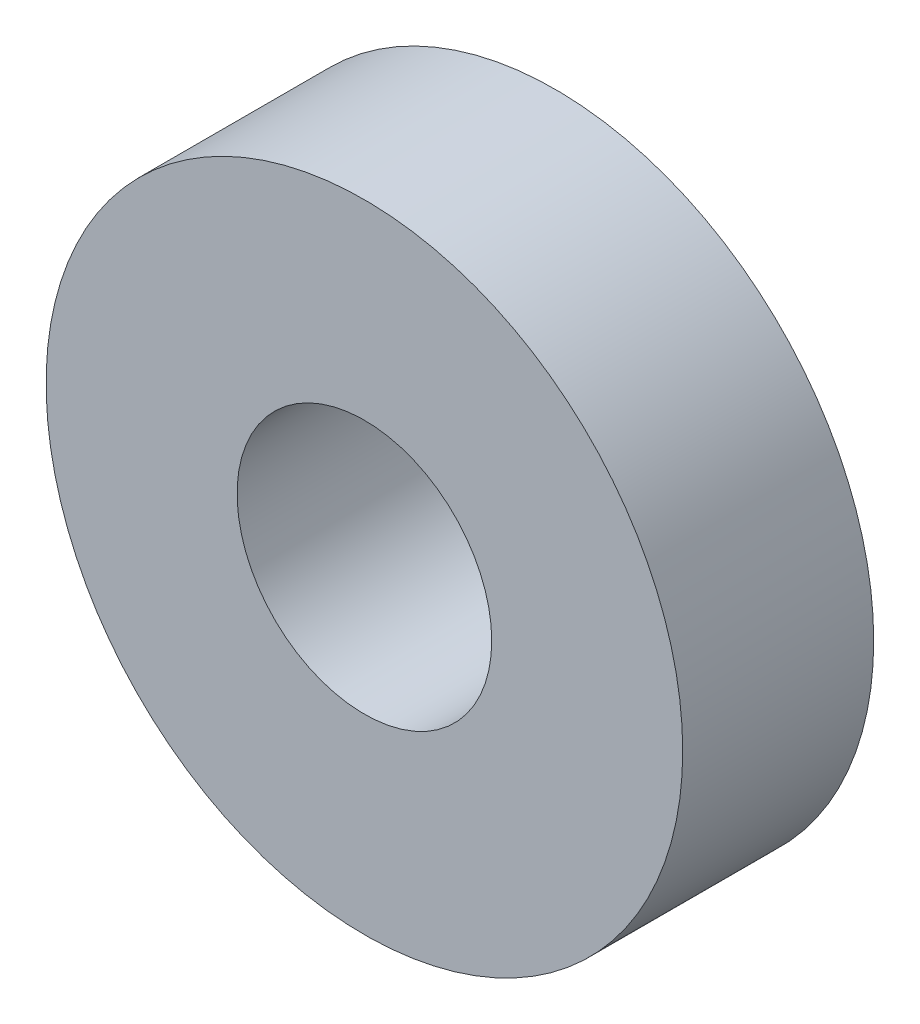
ISO-10303-21;
HEADER;
FILE_DESCRIPTION(('STEP AP214'),'2;1');
FILE_NAME('part.step','',(''),(''),'','','');
FILE_SCHEMA(('AUTOMOTIVE_DESIGN { 1 0 10303 214 1 1 1 1 }'));
ENDSEC;
DATA;
#1=APPLICATION_CONTEXT('core data for automotive mechanical design processes');
#2=APPLICATION_PROTOCOL_DEFINITION('international standard','automotive_design',2000,#1);
#3=PRODUCT_CONTEXT('',#1,'mechanical');
#4=PRODUCT('Part','Part','',(#3));
#5=PRODUCT_RELATED_PRODUCT_CATEGORY('part','',(#4));
#6=PRODUCT_DEFINITION_FORMATION('','',#4);
#7=PRODUCT_DEFINITION_CONTEXT('part definition',#1,'design');
#8=PRODUCT_DEFINITION('design','',#6,#7);
#9=PRODUCT_DEFINITION_SHAPE('','',#8);
#10=(LENGTH_UNIT() NAMED_UNIT(*) SI_UNIT(.MILLI.,.METRE.));
#11=(NAMED_UNIT(*) PLANE_ANGLE_UNIT() SI_UNIT($,.RADIAN.));
#12=(NAMED_UNIT(*) SI_UNIT($,.STERADIAN.) SOLID_ANGLE_UNIT());
#13=UNCERTAINTY_MEASURE_WITH_UNIT(LENGTH_MEASURE(1.E-05),#10,'distance_accuracy_value','');
#14=(GEOMETRIC_REPRESENTATION_CONTEXT(3) GLOBAL_UNCERTAINTY_ASSIGNED_CONTEXT((#13)) GLOBAL_UNIT_ASSIGNED_CONTEXT((#10,
#11,#12)) REPRESENTATION_CONTEXT('',''));
#15=CARTESIAN_POINT('',(0.,0.,0.));
#16=DIRECTION('',(0.,0.,1.));
#17=DIRECTION('',(1.,0.,0.));
#18=AXIS2_PLACEMENT_3D('',#15,#16,#17);
#19=CARTESIAN_POINT('',(0.,0.,1.5));
#20=DIRECTION('',(0.,0.,1.));
#21=DIRECTION('',(1.,0.,0.));
#22=AXIS2_PLACEMENT_3D('',#19,#20,#21);
#23=PLANE('',#22);
#24=CARTESIAN_POINT('',(0.,0.,1.5));
#25=DIRECTION('',(0.,0.,1.));
#26=DIRECTION('',(1.,0.,0.));
#27=AXIS2_PLACEMENT_3D('',#24,#25,#26);
#28=CIRCLE('',#27,2.5);
#29=CARTESIAN_POINT('',(2.5,0.,1.5));
#30=VERTEX_POINT('',#29);
#31=EDGE_CURVE('E10',#30,#30,#28,.T.);
#32=ORIENTED_EDGE('',*,*,#31,.T.);
#33=EDGE_LOOP('',(#32));
#34=FACE_BOUND('',#33,.T.);
#35=CARTESIAN_POINT('',(0.,0.,1.5));
#36=DIRECTION('',(0.,0.,1.));
#37=DIRECTION('',(1.,0.,0.));
#38=AXIS2_PLACEMENT_3D('',#35,#36,#37);
#39=CIRCLE('',#38,1.);
#40=CARTESIAN_POINT('',(1.,0.,1.5));
#41=VERTEX_POINT('',#40);
#42=EDGE_CURVE('E43',#41,#41,#39,.T.);
#43=ORIENTED_EDGE('',*,*,#42,.F.);
#44=EDGE_LOOP('',(#43));
#45=FACE_BOUND('',#44,.T.);
#46=ADVANCED_FACE('F32',(#34,#45),#23,.T.);
#47=CARTESIAN_POINT('',(0.,0.,0.));
#48=DIRECTION('',(0.,0.,1.));
#49=DIRECTION('',(1.,0.,0.));
#50=AXIS2_PLACEMENT_3D('',#47,#48,#49);
#51=PLANE('',#50);
#52=CARTESIAN_POINT('',(0.,0.,0.));
#53=DIRECTION('',(0.,0.,1.));
#54=DIRECTION('',(1.,0.,0.));
#55=AXIS2_PLACEMENT_3D('',#52,#53,#54);
#56=CIRCLE('',#55,2.5);
#57=CARTESIAN_POINT('',(2.5,0.,0.));
#58=VERTEX_POINT('',#57);
#59=EDGE_CURVE('E36',#58,#58,#56,.T.);
#60=ORIENTED_EDGE('',*,*,#59,.F.);
#61=EDGE_LOOP('',(#60));
#62=FACE_BOUND('',#61,.T.);
#63=CARTESIAN_POINT('',(0.,0.,0.));
#64=DIRECTION('',(0.,0.,1.));
#65=DIRECTION('',(1.,0.,0.));
#66=AXIS2_PLACEMENT_3D('',#63,#64,#65);
#67=CIRCLE('',#66,1.);
#68=CARTESIAN_POINT('',(1.,0.,0.));
#69=VERTEX_POINT('',#68);
#70=EDGE_CURVE('E45',#69,#69,#67,.T.);
#71=ORIENTED_EDGE('',*,*,#70,.T.);
#72=EDGE_LOOP('',(#71));
#73=FACE_BOUND('',#72,.T.);
#74=ADVANCED_FACE('F55',(#62,#73),#51,.F.);
#75=CARTESIAN_POINT('',(0.,0.,1.5));
#76=DIRECTION('',(0.,0.,-1.));
#77=DIRECTION('',(-1.,0.,0.));
#78=AXIS2_PLACEMENT_3D('',#75,#76,#77);
#79=CYLINDRICAL_SURFACE('',#78,2.5);
#80=ORIENTED_EDGE('',*,*,#31,.F.);
#81=EDGE_LOOP('',(#80));
#82=FACE_BOUND('',#81,.T.);
#83=ORIENTED_EDGE('',*,*,#59,.T.);
#84=EDGE_LOOP('',(#83));
#85=FACE_BOUND('',#84,.T.);
#86=ADVANCED_FACE('F34',(#82,#85),#79,.T.);
#87=CARTESIAN_POINT('',(0.,0.,1.5));
#88=DIRECTION('',(0.,0.,-1.));
#89=DIRECTION('',(-1.,0.,0.));
#90=AXIS2_PLACEMENT_3D('',#87,#88,#89);
#91=CYLINDRICAL_SURFACE('',#90,1.);
#92=ORIENTED_EDGE('',*,*,#42,.T.);
#93=EDGE_LOOP('',(#92));
#94=FACE_BOUND('',#93,.T.);
#95=ORIENTED_EDGE('',*,*,#70,.F.);
#96=EDGE_LOOP('',(#95));
#97=FACE_BOUND('',#96,.T.);
#98=ADVANCED_FACE('F51',(#94,#97),#91,.F.);
#99=CLOSED_SHELL('',(#46,#74,#86,#98));
#100=MANIFOLD_SOLID_BREP('B2',#99);
#101=ADVANCED_BREP_SHAPE_REPRESENTATION('',(#18,#100),#14);
#102=SHAPE_DEFINITION_REPRESENTATION(#9,#101);
ENDSEC;
END-ISO-10303-21;
